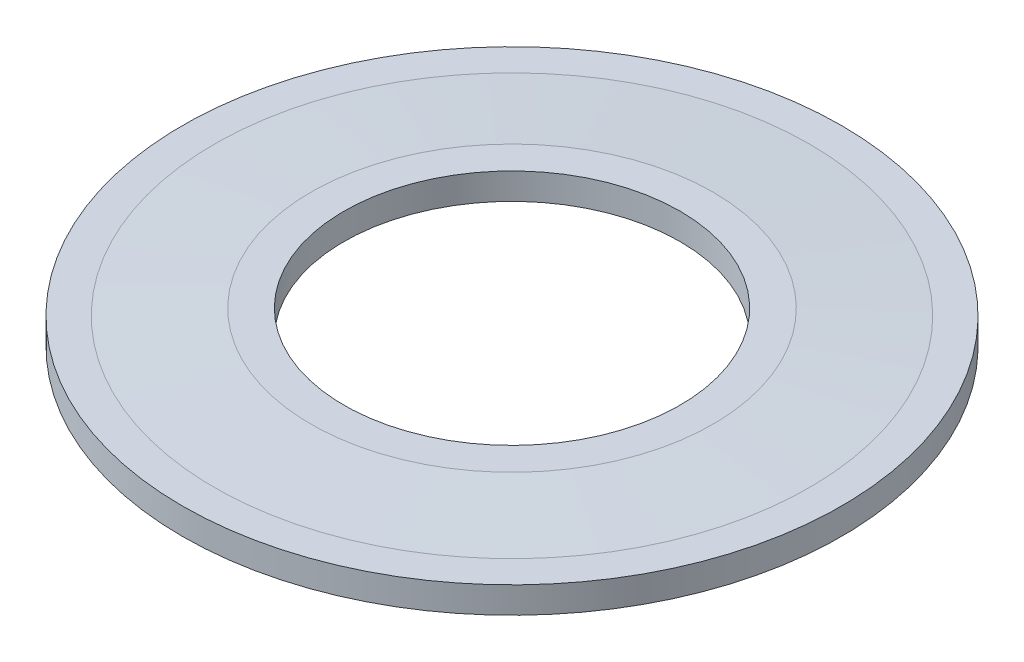
ISO-10303-21;
HEADER;
FILE_DESCRIPTION(('STEP AP214'),'2;1');
FILE_NAME('part.step','',(''),(''),'','','');
FILE_SCHEMA(('AUTOMOTIVE_DESIGN { 1 0 10303 214 1 1 1 1 }'));
ENDSEC;
DATA;
#1=APPLICATION_CONTEXT('core data for automotive mechanical design processes');
#2=APPLICATION_PROTOCOL_DEFINITION('international standard','automotive_design',2000,#1);
#3=PRODUCT_CONTEXT('',#1,'mechanical');
#4=PRODUCT('Part','Part','',(#3));
#5=PRODUCT_RELATED_PRODUCT_CATEGORY('part','',(#4));
#6=PRODUCT_DEFINITION_FORMATION('','',#4);
#7=PRODUCT_DEFINITION_CONTEXT('part definition',#1,'design');
#8=PRODUCT_DEFINITION('design','',#6,#7);
#9=PRODUCT_DEFINITION_SHAPE('','',#8);
#10=(LENGTH_UNIT() NAMED_UNIT(*) SI_UNIT(.MILLI.,.METRE.));
#11=(NAMED_UNIT(*) PLANE_ANGLE_UNIT() SI_UNIT($,.RADIAN.));
#12=(NAMED_UNIT(*) SI_UNIT($,.STERADIAN.) SOLID_ANGLE_UNIT());
#13=UNCERTAINTY_MEASURE_WITH_UNIT(LENGTH_MEASURE(1.E-05),#10,'distance_accuracy_value','');
#14=(GEOMETRIC_REPRESENTATION_CONTEXT(3) GLOBAL_UNCERTAINTY_ASSIGNED_CONTEXT((#13)) GLOBAL_UNIT_ASSIGNED_CONTEXT((#10,
#11,#12)) REPRESENTATION_CONTEXT('',''));
#15=CARTESIAN_POINT('',(0.,0.,0.));
#16=DIRECTION('',(0.,0.,1.));
#17=DIRECTION('',(1.,0.,0.));
#18=AXIS2_PLACEMENT_3D('',#15,#16,#17);
#19=CARTESIAN_POINT('',(0.,0.,0.));
#20=DIRECTION('',(0.,-1.,0.));
#21=DIRECTION('',(0.,0.,-1.));
#22=AXIS2_PLACEMENT_3D('',#19,#20,#21);
#23=CYLINDRICAL_SURFACE('',#22,10.);
#24=CARTESIAN_POINT('',(0.,0.,0.));
#25=DIRECTION('',(0.,-1.,0.));
#26=DIRECTION('',(0.,0.,-1.));
#27=AXIS2_PLACEMENT_3D('',#24,#25,#26);
#28=CIRCLE('',#27,10.);
#29=CARTESIAN_POINT('',(0.,0.,-10.));
#30=VERTEX_POINT('',#29);
#31=EDGE_CURVE('E10',#30,#30,#28,.T.);
#32=ORIENTED_EDGE('',*,*,#31,.F.);
#33=EDGE_LOOP('',(#32));
#34=FACE_BOUND('',#33,.T.);
#35=CARTESIAN_POINT('',(0.,0.800000000000003,0.));
#36=DIRECTION('',(0.,-1.,0.));
#37=DIRECTION('',(0.,0.,-1.));
#38=AXIS2_PLACEMENT_3D('',#35,#36,#37);
#39=CIRCLE('',#38,10.);
#40=CARTESIAN_POINT('',(0.,0.800000000000003,-10.));
#41=VERTEX_POINT('',#40);
#42=EDGE_CURVE('E74',#41,#41,#39,.T.);
#43=ORIENTED_EDGE('',*,*,#42,.T.);
#44=EDGE_LOOP('',(#43));
#45=FACE_BOUND('',#44,.T.);
#46=ADVANCED_FACE('F39',(#34,#45),#23,.T.);
#47=CARTESIAN_POINT('',(-10.,0.,0.));
#48=DIRECTION('',(0.,1.,0.));
#49=DIRECTION('',(0.,0.,1.));
#50=AXIS2_PLACEMENT_3D('',#47,#48,#49);
#51=PLANE('',#50);
#52=CARTESIAN_POINT('',(0.,0.,0.));
#53=DIRECTION('',(0.,-1.,0.));
#54=DIRECTION('',(0.,0.,-1.));
#55=AXIS2_PLACEMENT_3D('',#52,#53,#54);
#56=CIRCLE('',#55,9.);
#57=CARTESIAN_POINT('',(0.,0.,-9.));
#58=VERTEX_POINT('',#57);
#59=EDGE_CURVE('E46',#58,#58,#56,.T.);
#60=ORIENTED_EDGE('',*,*,#59,.F.);
#61=EDGE_LOOP('',(#60));
#62=FACE_BOUND('',#61,.T.);
#63=ORIENTED_EDGE('',*,*,#31,.T.);
#64=EDGE_LOOP('',(#63));
#65=FACE_BOUND('',#64,.T.);
#66=ADVANCED_FACE('F112',(#62,#65),#51,.F.);
#67=CARTESIAN_POINT('',(0.,0.,0.));
#68=DIRECTION('',(0.,-1.,0.));
#69=DIRECTION('',(0.,0.,-1.));
#70=AXIS2_PLACEMENT_3D('',#67,#68,#69);
#71=CONICAL_SURFACE('',#70,9.,1.50257992718552);
#72=CARTESIAN_POINT('',(0.,0.2,0.));
#73=DIRECTION('',(0.,-1.,0.));
#74=DIRECTION('',(0.,0.,-1.));
#75=AXIS2_PLACEMENT_3D('',#72,#73,#74);
#76=CIRCLE('',#75,6.07270285378125);
#77=CARTESIAN_POINT('',(0.,0.2,-6.07270285378125));
#78=VERTEX_POINT('',#77);
#79=EDGE_CURVE('E51',#78,#78,#76,.T.);
#80=ORIENTED_EDGE('',*,*,#79,.F.);
#81=EDGE_LOOP('',(#80));
#82=FACE_BOUND('',#81,.T.);
#83=ORIENTED_EDGE('',*,*,#59,.T.);
#84=EDGE_LOOP('',(#83));
#85=FACE_BOUND('',#84,.T.);
#86=ADVANCED_FACE('F107',(#82,#85),#71,.F.);
#87=CARTESIAN_POINT('',(-6.07270285378125,0.199999999999999,0.));
#88=DIRECTION('',(0.,1.,0.));
#89=DIRECTION('',(0.,0.,1.));
#90=AXIS2_PLACEMENT_3D('',#87,#88,#89);
#91=PLANE('',#90);
#92=CARTESIAN_POINT('',(0.,0.199999999999999,0.));
#93=DIRECTION('',(0.,-1.,0.));
#94=DIRECTION('',(0.,0.,-1.));
#95=AXIS2_PLACEMENT_3D('',#92,#93,#94);
#96=CIRCLE('',#95,5.1);
#97=CARTESIAN_POINT('',(0.,0.199999999999999,-5.1));
#98=VERTEX_POINT('',#97);
#99=EDGE_CURVE('E56',#98,#98,#96,.T.);
#100=ORIENTED_EDGE('',*,*,#99,.F.);
#101=EDGE_LOOP('',(#100));
#102=FACE_BOUND('',#101,.T.);
#103=ORIENTED_EDGE('',*,*,#79,.T.);
#104=EDGE_LOOP('',(#103));
#105=FACE_BOUND('',#104,.T.);
#106=ADVANCED_FACE('F101',(#102,#105),#91,.F.);
#107=CARTESIAN_POINT('',(0.,0.,0.));
#108=DIRECTION('',(0.,-1.,0.));
#109=DIRECTION('',(0.,0.,-1.));
#110=AXIS2_PLACEMENT_3D('',#107,#108,#109);
#111=CYLINDRICAL_SURFACE('',#110,5.1);
#112=CARTESIAN_POINT('',(0.,0.999999999999999,0.));
#113=DIRECTION('',(0.,-1.,0.));
#114=DIRECTION('',(0.,0.,-1.));
#115=AXIS2_PLACEMENT_3D('',#112,#113,#114);
#116=CIRCLE('',#115,5.1);
#117=CARTESIAN_POINT('',(0.,0.999999999999999,-5.1));
#118=VERTEX_POINT('',#117);
#119=EDGE_CURVE('E62',#118,#118,#116,.T.);
#120=ORIENTED_EDGE('',*,*,#119,.F.);
#121=EDGE_LOOP('',(#120));
#122=FACE_BOUND('',#121,.T.);
#123=ORIENTED_EDGE('',*,*,#99,.T.);
#124=EDGE_LOOP('',(#123));
#125=FACE_BOUND('',#124,.T.);
#126=ADVANCED_FACE('F95',(#122,#125),#111,.F.);
#127=CARTESIAN_POINT('',(-5.1,0.999999999999999,0.));
#128=DIRECTION('',(0.,-1.,0.));
#129=DIRECTION('',(0.,0.,-1.));
#130=AXIS2_PLACEMENT_3D('',#127,#128,#129);
#131=PLANE('',#130);
#132=CARTESIAN_POINT('',(0.,0.999999999999999,0.));
#133=DIRECTION('',(0.,-1.,0.));
#134=DIRECTION('',(0.,0.,-1.));
#135=AXIS2_PLACEMENT_3D('',#132,#133,#134);
#136=CIRCLE('',#135,6.1);
#137=CARTESIAN_POINT('',(0.,0.999999999999999,-6.1));
#138=VERTEX_POINT('',#137);
#139=EDGE_CURVE('E66',#138,#138,#136,.T.);
#140=ORIENTED_EDGE('',*,*,#139,.F.);
#141=EDGE_LOOP('',(#140));
#142=FACE_BOUND('',#141,.T.);
#143=ORIENTED_EDGE('',*,*,#119,.T.);
#144=EDGE_LOOP('',(#143));
#145=FACE_BOUND('',#144,.T.);
#146=ADVANCED_FACE('F89',(#142,#145),#131,.F.);
#147=CARTESIAN_POINT('',(0.,0.999999999999999,0.));
#148=DIRECTION('',(0.,-1.,0.));
#149=DIRECTION('',(0.,0.,-1.));
#150=AXIS2_PLACEMENT_3D('',#147,#148,#149);
#151=CONICAL_SURFACE('',#150,6.1,1.50257992718552);
#152=CARTESIAN_POINT('',(0.,0.800000000000003,0.));
#153=DIRECTION('',(0.,-1.,0.));
#154=DIRECTION('',(0.,0.,-1.));
#155=AXIS2_PLACEMENT_3D('',#152,#153,#154);
#156=CIRCLE('',#155,9.02729714621866);
#157=CARTESIAN_POINT('',(0.,0.800000000000003,-9.02729714621866));
#158=VERTEX_POINT('',#157);
#159=EDGE_CURVE('E70',#158,#158,#156,.T.);
#160=ORIENTED_EDGE('',*,*,#159,.F.);
#161=EDGE_LOOP('',(#160));
#162=FACE_BOUND('',#161,.T.);
#163=ORIENTED_EDGE('',*,*,#139,.T.);
#164=EDGE_LOOP('',(#163));
#165=FACE_BOUND('',#164,.T.);
#166=ADVANCED_FACE('F83',(#162,#165),#151,.T.);
#167=CARTESIAN_POINT('',(-9.02729714621866,0.800000000000003,0.));
#168=DIRECTION('',(0.,-1.,0.));
#169=DIRECTION('',(0.,0.,-1.));
#170=AXIS2_PLACEMENT_3D('',#167,#168,#169);
#171=PLANE('',#170);
#172=ORIENTED_EDGE('',*,*,#42,.F.);
#173=EDGE_LOOP('',(#172));
#174=FACE_BOUND('',#173,.T.);
#175=ORIENTED_EDGE('',*,*,#159,.T.);
#176=EDGE_LOOP('',(#175));
#177=FACE_BOUND('',#176,.T.);
#178=ADVANCED_FACE('F80',(#174,#177),#171,.F.);
#179=CLOSED_SHELL('',(#46,#66,#86,#106,#126,#146,#166,#178));
#180=MANIFOLD_SOLID_BREP('B2',#179);
#181=ADVANCED_BREP_SHAPE_REPRESENTATION('',(#18,#180),#14);
#182=SHAPE_DEFINITION_REPRESENTATION(#9,#181);
ENDSEC;
END-ISO-10303-21;
